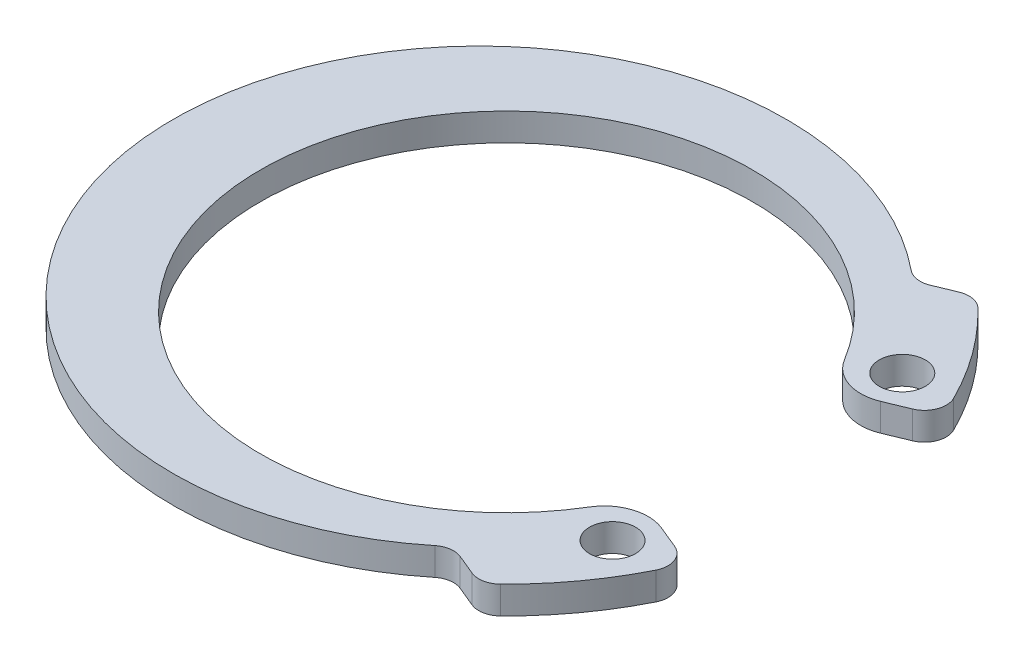
ISO-10303-21;
HEADER;
FILE_DESCRIPTION(('STEP AP214'),'2;1');
FILE_NAME('part.step','',(''),(''),'','','');
FILE_SCHEMA(('AUTOMOTIVE_DESIGN { 1 0 10303 214 1 1 1 1 }'));
ENDSEC;
DATA;
#1=APPLICATION_CONTEXT('core data for automotive mechanical design processes');
#2=APPLICATION_PROTOCOL_DEFINITION('international standard','automotive_design',2000,#1);
#3=PRODUCT_CONTEXT('',#1,'mechanical');
#4=PRODUCT('Part','Part','',(#3));
#5=PRODUCT_RELATED_PRODUCT_CATEGORY('part','',(#4));
#6=PRODUCT_DEFINITION_FORMATION('','',#4);
#7=PRODUCT_DEFINITION_CONTEXT('part definition',#1,'design');
#8=PRODUCT_DEFINITION('design','',#6,#7);
#9=PRODUCT_DEFINITION_SHAPE('','',#8);
#10=(LENGTH_UNIT() NAMED_UNIT(*) SI_UNIT(.MILLI.,.METRE.));
#11=(NAMED_UNIT(*) PLANE_ANGLE_UNIT() SI_UNIT($,.RADIAN.));
#12=(NAMED_UNIT(*) SI_UNIT($,.STERADIAN.) SOLID_ANGLE_UNIT());
#13=UNCERTAINTY_MEASURE_WITH_UNIT(LENGTH_MEASURE(1.E-05),#10,'distance_accuracy_value','');
#14=(GEOMETRIC_REPRESENTATION_CONTEXT(3) GLOBAL_UNCERTAINTY_ASSIGNED_CONTEXT((#13)) GLOBAL_UNIT_ASSIGNED_CONTEXT((#10,
#11,#12)) REPRESENTATION_CONTEXT('',''));
#15=CARTESIAN_POINT('',(0.,0.,0.));
#16=DIRECTION('',(0.,0.,1.));
#17=DIRECTION('',(1.,0.,0.));
#18=AXIS2_PLACEMENT_3D('',#15,#16,#17);
#19=CARTESIAN_POINT('',(4.7270544777057,0.3,4.85340921052434));
#20=DIRECTION('',(0.,1.,0.));
#21=DIRECTION('',(0.,0.,1.));
#22=AXIS2_PLACEMENT_3D('',#19,#20,#21);
#23=PLANE('',#22);
#24=CARTESIAN_POINT('',(5.45596004384196,0.3,3.15000000000001));
#25=DIRECTION('',(0.,1.,0.));
#26=DIRECTION('',(0.,0.,1.));
#27=AXIS2_PLACEMENT_3D('',#24,#25,#26);
#28=CIRCLE('',#27,0.5);
#29=CARTESIAN_POINT('',(5.45596004384196,0.3,3.65000000000001));
#30=VERTEX_POINT('',#29);
#31=EDGE_CURVE('E222',#30,#30,#28,.T.);
#32=ORIENTED_EDGE('',*,*,#31,.F.);
#33=EDGE_LOOP('',(#32));
#34=FACE_BOUND('',#33,.T.);
#35=CARTESIAN_POINT('',(4.7270544777057,0.3,4.85340921052434));
#36=DIRECTION('',(0.,1.,0.));
#37=DIRECTION('',(0.,0.,1.));
#38=AXIS2_PLACEMENT_3D('',#35,#36,#37);
#39=CIRCLE('',#38,0.475);
#40=CARTESIAN_POINT('',(4.54527984733229,0.3,5.2922519884672));
#41=VERTEX_POINT('',#40);
#42=CARTESIAN_POINT('',(5.05847158130869,0.3,5.19368513303342));
#43=VERTEX_POINT('',#42);
#44=EDGE_CURVE('E225',#41,#43,#39,.T.);
#45=ORIENTED_EDGE('',*,*,#44,.T.);
#46=CARTESIAN_POINT('',(0.,0.3,0.));
#47=DIRECTION('',(0.,1.,0.));
#48=DIRECTION('',(0.,0.,1.));
#49=AXIS2_PLACEMENT_3D('',#46,#47,#48);
#50=CIRCLE('',#49,7.25);
#51=CARTESIAN_POINT('',(6.48712499791998,0.3,3.23723790620364));
#52=VERTEX_POINT('',#51);
#53=EDGE_CURVE('E157',#43,#52,#50,.T.);
#54=ORIENTED_EDGE('',*,*,#53,.T.);
#55=CARTESIAN_POINT('',(6.0621064635735,0.3,3.02514300890064));
#56=DIRECTION('',(0.,1.,0.));
#57=DIRECTION('',(0.,0.,-1.));
#58=AXIS2_PLACEMENT_3D('',#55,#56,#57);
#59=CIRCLE('',#58,0.475);
#60=CARTESIAN_POINT('',(6.24388109394692,0.3,2.58630023095778));
#61=VERTEX_POINT('',#60);
#62=EDGE_CURVE('E228',#52,#61,#59,.T.);
#63=ORIENTED_EDGE('',*,*,#62,.T.);
#64=DIRECTION('',(-0.923879532511286,0.,-0.382683432365091));
#65=VECTOR('',#64,1.);
#66=CARTESIAN_POINT('',(5.75388582938839,0.3,2.38333754687904));
#67=LINE('',#66,#65);
#68=CARTESIAN_POINT('',(5.75388582938839,0.3,2.38333754687904));
#69=VERTEX_POINT('',#68);
#70=EDGE_CURVE('E230',#61,#69,#67,.T.);
#71=ORIENTED_EDGE('',*,*,#70,.T.);
#72=CARTESIAN_POINT('',(5.39033656864156,0.3,3.26102310276477));
#73=DIRECTION('',(0.,1.,0.));
#74=DIRECTION('',(0.,0.,1.));
#75=AXIS2_PLACEMENT_3D('',#72,#73,#74);
#76=CIRCLE('',#75,0.949999999999999);
#77=CARTESIAN_POINT('',(4.57750803844958,0.3,2.76928152377643));
#78=VERTEX_POINT('',#77);
#79=EDGE_CURVE('E232',#69,#78,#76,.T.);
#80=ORIENTED_EDGE('',*,*,#79,.T.);
#81=CARTESIAN_POINT('',(0.,0.3,0.));
#82=DIRECTION('',(0.,-1.,0.));
#83=DIRECTION('',(0.,0.,1.));
#84=AXIS2_PLACEMENT_3D('',#81,#82,#83);
#85=CIRCLE('',#84,5.35);
#86=CARTESIAN_POINT('',(4.57750803844958,0.3,-2.76928152377643));
#87=VERTEX_POINT('',#86);
#88=EDGE_CURVE('E234',#78,#87,#85,.T.);
#89=ORIENTED_EDGE('',*,*,#88,.T.);
#90=CARTESIAN_POINT('',(5.39033656864156,0.3,-3.26102310276477));
#91=DIRECTION('',(0.,1.,0.));
#92=DIRECTION('',(0.,0.,-1.));
#93=AXIS2_PLACEMENT_3D('',#90,#91,#92);
#94=CIRCLE('',#93,0.95);
#95=CARTESIAN_POINT('',(5.75388582938839,0.3,-2.38333754687904));
#96=VERTEX_POINT('',#95);
#97=EDGE_CURVE('E236',#87,#96,#94,.T.);
#98=ORIENTED_EDGE('',*,*,#97,.T.);
#99=DIRECTION('',(0.923879532511287,0.,-0.38268343236509));
#100=VECTOR('',#99,1.);
#101=CARTESIAN_POINT('',(5.75388582938839,0.3,-2.38333754687904));
#102=LINE('',#101,#100);
#103=CARTESIAN_POINT('',(6.24388109394692,0.3,-2.58630023095778));
#104=VERTEX_POINT('',#103);
#105=EDGE_CURVE('E238',#96,#104,#102,.T.);
#106=ORIENTED_EDGE('',*,*,#105,.T.);
#107=CARTESIAN_POINT('',(6.0621064635735,0.3,-3.02514300890064));
#108=DIRECTION('',(0.,1.,0.));
#109=DIRECTION('',(0.,0.,1.));
#110=AXIS2_PLACEMENT_3D('',#107,#108,#109);
#111=CIRCLE('',#110,0.475000000000001);
#112=CARTESIAN_POINT('',(6.48712499791998,0.3,-3.23723790620364));
#113=VERTEX_POINT('',#112);
#114=EDGE_CURVE('E240',#104,#113,#111,.T.);
#115=ORIENTED_EDGE('',*,*,#114,.T.);
#116=CARTESIAN_POINT('',(0.,0.3,0.));
#117=DIRECTION('',(0.,1.,0.));
#118=DIRECTION('',(0.,0.,-1.));
#119=AXIS2_PLACEMENT_3D('',#116,#117,#118);
#120=CIRCLE('',#119,7.25);
#121=CARTESIAN_POINT('',(5.05847158130868,0.3,-5.19368513303342));
#122=VERTEX_POINT('',#121);
#123=EDGE_CURVE('E242',#113,#122,#120,.T.);
#124=ORIENTED_EDGE('',*,*,#123,.T.);
#125=CARTESIAN_POINT('',(4.7270544777057,0.3,-4.85340921052434));
#126=DIRECTION('',(0.,1.,0.));
#127=DIRECTION('',(0.,0.,-1.));
#128=AXIS2_PLACEMENT_3D('',#125,#126,#127);
#129=CIRCLE('',#128,0.475000000000001);
#130=CARTESIAN_POINT('',(4.54527984733228,0.3,-5.2922519884672));
#131=VERTEX_POINT('',#130);
#132=EDGE_CURVE('E244',#122,#131,#129,.T.);
#133=ORIENTED_EDGE('',*,*,#132,.T.);
#134=DIRECTION('',(-0.923879532511286,0.,0.382683432365091));
#135=VECTOR('',#134,1.);
#136=CARTESIAN_POINT('',(4.10274092218613,0.3,-5.10894636379365));
#137=LINE('',#136,#135);
#138=CARTESIAN_POINT('',(4.10274092218613,0.3,-5.10894636379365));
#139=VERTEX_POINT('',#138);
#140=EDGE_CURVE('E246',#131,#139,#137,.T.);
#141=ORIENTED_EDGE('',*,*,#140,.T.);
#142=CARTESIAN_POINT('',(3.92096629181271,0.3,-5.54778914173651));
#143=DIRECTION('',(0.,-1.,0.));
#144=DIRECTION('',(0.,0.,1.));
#145=AXIS2_PLACEMENT_3D('',#142,#143,#144);
#146=CIRCLE('',#145,0.475);
#147=CARTESIAN_POINT('',(3.62167497495327,0.3,-5.1789399752029));
#148=VERTEX_POINT('',#147);
#149=EDGE_CURVE('E248',#139,#148,#146,.T.);
#150=ORIENTED_EDGE('',*,*,#149,.T.);
#151=CARTESIAN_POINT('',(-0.580616654661206,0.3,0.));
#152=DIRECTION('',(0.,1.,0.));
#153=DIRECTION('',(0.,0.,1.));
#154=AXIS2_PLACEMENT_3D('',#151,#152,#153);
#155=CIRCLE('',#154,6.66938334533879);
#156=CARTESIAN_POINT('',(3.62167497495327,0.3,5.1789399752029));
#157=VERTEX_POINT('',#156);
#158=EDGE_CURVE('E250',#148,#157,#155,.T.);
#159=ORIENTED_EDGE('',*,*,#158,.T.);
#160=CARTESIAN_POINT('',(3.92096629181271,0.3,5.54778914173651));
#161=DIRECTION('',(0.,-1.,0.));
#162=DIRECTION('',(0.,0.,-1.));
#163=AXIS2_PLACEMENT_3D('',#160,#161,#162);
#164=CIRCLE('',#163,0.474999999999999);
#165=CARTESIAN_POINT('',(4.10274092218613,0.3,5.10894636379365));
#166=VERTEX_POINT('',#165);
#167=EDGE_CURVE('E61',#157,#166,#164,.T.);
#168=ORIENTED_EDGE('',*,*,#167,.T.);
#169=DIRECTION('',(0.923879532511287,0.,0.382683432365089));
#170=VECTOR('',#169,1.);
#171=CARTESIAN_POINT('',(4.10274092218613,0.3,5.10894636379365));
#172=LINE('',#171,#170);
#173=EDGE_CURVE('E56',#166,#41,#172,.T.);
#174=ORIENTED_EDGE('',*,*,#173,.T.);
#175=EDGE_LOOP('',(#45,#54,#63,#71,#80,#89,#98,#106,#115,#124,#133,#141,#150,#159,#168,#174));
#176=FACE_BOUND('',#175,.T.);
#177=CARTESIAN_POINT('',(5.45596004384196,0.3,-3.15000000000001));
#178=DIRECTION('',(0.,1.,0.));
#179=DIRECTION('',(0.,0.,1.));
#180=AXIS2_PLACEMENT_3D('',#177,#178,#179);
#181=CIRCLE('',#180,0.5);
#182=CARTESIAN_POINT('',(5.45596004384196,0.3,-2.65000000000001));
#183=VERTEX_POINT('',#182);
#184=EDGE_CURVE('E219',#183,#183,#181,.T.);
#185=ORIENTED_EDGE('',*,*,#184,.F.);
#186=EDGE_LOOP('',(#185));
#187=FACE_BOUND('',#186,.T.);
#188=ADVANCED_FACE('F41',(#34,#176,#187),#23,.T.);
#189=CARTESIAN_POINT('',(4.7270544777057,0.3,4.85340921052434));
#190=DIRECTION('',(0.,-1.,0.));
#191=DIRECTION('',(0.,0.,-1.));
#192=AXIS2_PLACEMENT_3D('',#189,#190,#191);
#193=CYLINDRICAL_SURFACE('',#192,0.475);
#194=DIRECTION('',(0.,-1.,0.));
#195=VECTOR('',#194,1.);
#196=CARTESIAN_POINT('',(4.54527984733229,0.3,5.2922519884672));
#197=LINE('',#196,#195);
#198=CARTESIAN_POINT('',(4.54527984733229,-0.3,5.2922519884672));
#199=VERTEX_POINT('',#198);
#200=EDGE_CURVE('E172',#41,#199,#197,.T.);
#201=ORIENTED_EDGE('',*,*,#200,.T.);
#202=CARTESIAN_POINT('',(4.7270544777057,-0.3,4.85340921052434));
#203=DIRECTION('',(0.,1.,0.));
#204=DIRECTION('',(0.,0.,1.));
#205=AXIS2_PLACEMENT_3D('',#202,#203,#204);
#206=CIRCLE('',#205,0.475);
#207=CARTESIAN_POINT('',(5.05847158130869,-0.3,5.19368513303342));
#208=VERTEX_POINT('',#207);
#209=EDGE_CURVE('E166',#199,#208,#206,.T.);
#210=ORIENTED_EDGE('',*,*,#209,.T.);
#211=DIRECTION('',(0.,-1.,0.));
#212=VECTOR('',#211,1.);
#213=CARTESIAN_POINT('',(5.05847158130869,0.3,5.19368513303342));
#214=LINE('',#213,#212);
#215=EDGE_CURVE('E11',#43,#208,#214,.T.);
#216=ORIENTED_EDGE('',*,*,#215,.F.);
#217=ORIENTED_EDGE('',*,*,#44,.F.);
#218=EDGE_LOOP('',(#201,#210,#216,#217));
#219=FACE_BOUND('',#218,.T.);
#220=ADVANCED_FACE('F43',(#219),#193,.T.);
#221=CARTESIAN_POINT('',(0.,0.3,0.));
#222=DIRECTION('',(0.,-1.,0.));
#223=DIRECTION('',(0.,0.,-1.));
#224=AXIS2_PLACEMENT_3D('',#221,#222,#223);
#225=CYLINDRICAL_SURFACE('',#224,7.25);
#226=ORIENTED_EDGE('',*,*,#215,.T.);
#227=CARTESIAN_POINT('',(0.,-0.3,0.));
#228=DIRECTION('',(0.,1.,0.));
#229=DIRECTION('',(0.,0.,1.));
#230=AXIS2_PLACEMENT_3D('',#227,#228,#229);
#231=CIRCLE('',#230,7.25);
#232=CARTESIAN_POINT('',(6.48712499791998,-0.3,3.23723790620364));
#233=VERTEX_POINT('',#232);
#234=EDGE_CURVE('E156',#208,#233,#231,.T.);
#235=ORIENTED_EDGE('',*,*,#234,.T.);
#236=DIRECTION('',(0.,-1.,0.));
#237=VECTOR('',#236,1.);
#238=CARTESIAN_POINT('',(6.48712499791998,0.3,3.23723790620364));
#239=LINE('',#238,#237);
#240=EDGE_CURVE('E49',#52,#233,#239,.T.);
#241=ORIENTED_EDGE('',*,*,#240,.F.);
#242=ORIENTED_EDGE('',*,*,#53,.F.);
#243=EDGE_LOOP('',(#226,#235,#241,#242));
#244=FACE_BOUND('',#243,.T.);
#245=ADVANCED_FACE('F154',(#244),#225,.T.);
#246=CARTESIAN_POINT('',(6.0621064635735,0.3,3.02514300890064));
#247=DIRECTION('',(0.,-1.,0.));
#248=DIRECTION('',(0.,0.,-1.));
#249=AXIS2_PLACEMENT_3D('',#246,#247,#248);
#250=CYLINDRICAL_SURFACE('',#249,0.475);
#251=ORIENTED_EDGE('',*,*,#240,.T.);
#252=CARTESIAN_POINT('',(6.0621064635735,-0.3,3.02514300890064));
#253=DIRECTION('',(0.,1.,0.));
#254=DIRECTION('',(0.,0.,-1.));
#255=AXIS2_PLACEMENT_3D('',#252,#253,#254);
#256=CIRCLE('',#255,0.475);
#257=CARTESIAN_POINT('',(6.24388109394692,-0.3,2.58630023095778));
#258=VERTEX_POINT('',#257);
#259=EDGE_CURVE('E170',#233,#258,#256,.T.);
#260=ORIENTED_EDGE('',*,*,#259,.T.);
#261=DIRECTION('',(0.,-1.,0.));
#262=VECTOR('',#261,1.);
#263=CARTESIAN_POINT('',(6.24388109394692,0.3,2.58630023095778));
#264=LINE('',#263,#262);
#265=EDGE_CURVE('E279',#61,#258,#264,.T.);
#266=ORIENTED_EDGE('',*,*,#265,.F.);
#267=ORIENTED_EDGE('',*,*,#62,.F.);
#268=EDGE_LOOP('',(#251,#260,#266,#267));
#269=FACE_BOUND('',#268,.T.);
#270=ADVANCED_FACE('F282',(#269),#250,.T.);
#271=CARTESIAN_POINT('',(5.75388582938839,0.3,2.38333754687904));
#272=DIRECTION('',(-0.382683432365091,0.,0.923879532511286));
#273=DIRECTION('',(0.923879532511286,0.,0.382683432365091));
#274=AXIS2_PLACEMENT_3D('',#271,#272,#273);
#275=PLANE('',#274);
#276=ORIENTED_EDGE('',*,*,#265,.T.);
#277=DIRECTION('',(-0.923879532511286,0.,-0.382683432365091));
#278=VECTOR('',#277,1.);
#279=CARTESIAN_POINT('',(5.75388582938839,-0.3,2.38333754687904));
#280=LINE('',#279,#278);
#281=CARTESIAN_POINT('',(5.75388582938839,-0.3,2.38333754687904));
#282=VERTEX_POINT('',#281);
#283=EDGE_CURVE('E181',#258,#282,#280,.T.);
#284=ORIENTED_EDGE('',*,*,#283,.T.);
#285=DIRECTION('',(0.,-1.,0.));
#286=VECTOR('',#285,1.);
#287=CARTESIAN_POINT('',(5.75388582938839,0.3,2.38333754687904));
#288=LINE('',#287,#286);
#289=EDGE_CURVE('E277',#69,#282,#288,.T.);
#290=ORIENTED_EDGE('',*,*,#289,.F.);
#291=ORIENTED_EDGE('',*,*,#70,.F.);
#292=EDGE_LOOP('',(#276,#284,#290,#291));
#293=FACE_BOUND('',#292,.T.);
#294=ADVANCED_FACE('F290',(#293),#275,.F.);
#295=CARTESIAN_POINT('',(5.39033656864156,0.3,3.26102310276477));
#296=DIRECTION('',(0.,-1.,0.));
#297=DIRECTION('',(0.,0.,-1.));
#298=AXIS2_PLACEMENT_3D('',#295,#296,#297);
#299=CYLINDRICAL_SURFACE('',#298,0.949999999999999);
#300=ORIENTED_EDGE('',*,*,#289,.T.);
#301=CARTESIAN_POINT('',(5.39033656864156,-0.3,3.26102310276477));
#302=DIRECTION('',(0.,1.,0.));
#303=DIRECTION('',(0.,0.,1.));
#304=AXIS2_PLACEMENT_3D('',#301,#302,#303);
#305=CIRCLE('',#304,0.949999999999999);
#306=CARTESIAN_POINT('',(4.57750803844958,-0.3,2.76928152377643));
#307=VERTEX_POINT('',#306);
#308=EDGE_CURVE('E184',#282,#307,#305,.T.);
#309=ORIENTED_EDGE('',*,*,#308,.T.);
#310=DIRECTION('',(0.,-1.,0.));
#311=VECTOR('',#310,1.);
#312=CARTESIAN_POINT('',(4.57750803844958,0.3,2.76928152377643));
#313=LINE('',#312,#311);
#314=EDGE_CURVE('E275',#78,#307,#313,.T.);
#315=ORIENTED_EDGE('',*,*,#314,.F.);
#316=ORIENTED_EDGE('',*,*,#79,.F.);
#317=EDGE_LOOP('',(#300,#309,#315,#316));
#318=FACE_BOUND('',#317,.T.);
#319=ADVANCED_FACE('F293',(#318),#299,.T.);
#320=CARTESIAN_POINT('',(0.,0.3,0.));
#321=DIRECTION('',(0.,-1.,0.));
#322=DIRECTION('',(0.,0.,-1.));
#323=AXIS2_PLACEMENT_3D('',#320,#321,#322);
#324=CYLINDRICAL_SURFACE('',#323,5.35);
#325=ORIENTED_EDGE('',*,*,#314,.T.);
#326=CARTESIAN_POINT('',(0.,-0.3,0.));
#327=DIRECTION('',(0.,-1.,0.));
#328=DIRECTION('',(0.,0.,1.));
#329=AXIS2_PLACEMENT_3D('',#326,#327,#328);
#330=CIRCLE('',#329,5.35);
#331=CARTESIAN_POINT('',(4.57750803844958,-0.3,-2.76928152377643));
#332=VERTEX_POINT('',#331);
#333=EDGE_CURVE('E187',#307,#332,#330,.T.);
#334=ORIENTED_EDGE('',*,*,#333,.T.);
#335=DIRECTION('',(0.,-1.,0.));
#336=VECTOR('',#335,1.);
#337=CARTESIAN_POINT('',(4.57750803844958,0.3,-2.76928152377643));
#338=LINE('',#337,#336);
#339=EDGE_CURVE('E273',#87,#332,#338,.T.);
#340=ORIENTED_EDGE('',*,*,#339,.F.);
#341=ORIENTED_EDGE('',*,*,#88,.F.);
#342=EDGE_LOOP('',(#325,#334,#340,#341));
#343=FACE_BOUND('',#342,.T.);
#344=ADVANCED_FACE('F298',(#343),#324,.F.);
#345=CARTESIAN_POINT('',(5.39033656864156,0.3,-3.26102310276477));
#346=DIRECTION('',(0.,-1.,0.));
#347=DIRECTION('',(0.,0.,-1.));
#348=AXIS2_PLACEMENT_3D('',#345,#346,#347);
#349=CYLINDRICAL_SURFACE('',#348,0.95);
#350=ORIENTED_EDGE('',*,*,#339,.T.);
#351=CARTESIAN_POINT('',(5.39033656864156,-0.3,-3.26102310276477));
#352=DIRECTION('',(0.,1.,0.));
#353=DIRECTION('',(0.,0.,-1.));
#354=AXIS2_PLACEMENT_3D('',#351,#352,#353);
#355=CIRCLE('',#354,0.95);
#356=CARTESIAN_POINT('',(5.75388582938839,-0.3,-2.38333754687904));
#357=VERTEX_POINT('',#356);
#358=EDGE_CURVE('E190',#332,#357,#355,.T.);
#359=ORIENTED_EDGE('',*,*,#358,.T.);
#360=DIRECTION('',(0.,-1.,0.));
#361=VECTOR('',#360,1.);
#362=CARTESIAN_POINT('',(5.75388582938839,0.3,-2.38333754687904));
#363=LINE('',#362,#361);
#364=EDGE_CURVE('E271',#96,#357,#363,.T.);
#365=ORIENTED_EDGE('',*,*,#364,.F.);
#366=ORIENTED_EDGE('',*,*,#97,.F.);
#367=EDGE_LOOP('',(#350,#359,#365,#366));
#368=FACE_BOUND('',#367,.T.);
#369=ADVANCED_FACE('F304',(#368),#349,.T.);
#370=CARTESIAN_POINT('',(5.75388582938839,0.3,-2.38333754687904));
#371=DIRECTION('',(-0.38268343236509,0.,-0.923879532511287));
#372=DIRECTION('',(-0.923879532511287,0.,0.38268343236509));
#373=AXIS2_PLACEMENT_3D('',#370,#371,#372);
#374=PLANE('',#373);
#375=ORIENTED_EDGE('',*,*,#364,.T.);
#376=DIRECTION('',(0.923879532511287,0.,-0.38268343236509));
#377=VECTOR('',#376,1.);
#378=CARTESIAN_POINT('',(5.75388582938839,-0.3,-2.38333754687904));
#379=LINE('',#378,#377);
#380=CARTESIAN_POINT('',(6.24388109394692,-0.3,-2.58630023095778));
#381=VERTEX_POINT('',#380);
#382=EDGE_CURVE('E193',#357,#381,#379,.T.);
#383=ORIENTED_EDGE('',*,*,#382,.T.);
#384=DIRECTION('',(0.,-1.,0.));
#385=VECTOR('',#384,1.);
#386=CARTESIAN_POINT('',(6.24388109394692,0.3,-2.58630023095778));
#387=LINE('',#386,#385);
#388=EDGE_CURVE('E269',#104,#381,#387,.T.);
#389=ORIENTED_EDGE('',*,*,#388,.F.);
#390=ORIENTED_EDGE('',*,*,#105,.F.);
#391=EDGE_LOOP('',(#375,#383,#389,#390));
#392=FACE_BOUND('',#391,.T.);
#393=ADVANCED_FACE('F308',(#392),#374,.F.);
#394=CARTESIAN_POINT('',(6.0621064635735,0.3,-3.02514300890064));
#395=DIRECTION('',(0.,-1.,0.));
#396=DIRECTION('',(0.,0.,-1.));
#397=AXIS2_PLACEMENT_3D('',#394,#395,#396);
#398=CYLINDRICAL_SURFACE('',#397,0.475000000000001);
#399=ORIENTED_EDGE('',*,*,#388,.T.);
#400=CARTESIAN_POINT('',(6.0621064635735,-0.3,-3.02514300890064));
#401=DIRECTION('',(0.,1.,0.));
#402=DIRECTION('',(0.,0.,1.));
#403=AXIS2_PLACEMENT_3D('',#400,#401,#402);
#404=CIRCLE('',#403,0.475000000000001);
#405=CARTESIAN_POINT('',(6.48712499791998,-0.3,-3.23723790620364));
#406=VERTEX_POINT('',#405);
#407=EDGE_CURVE('E196',#381,#406,#404,.T.);
#408=ORIENTED_EDGE('',*,*,#407,.T.);
#409=DIRECTION('',(0.,-1.,0.));
#410=VECTOR('',#409,1.);
#411=CARTESIAN_POINT('',(6.48712499791998,0.3,-3.23723790620364));
#412=LINE('',#411,#410);
#413=EDGE_CURVE('E267',#113,#406,#412,.T.);
#414=ORIENTED_EDGE('',*,*,#413,.F.);
#415=ORIENTED_EDGE('',*,*,#114,.F.);
#416=EDGE_LOOP('',(#399,#408,#414,#415));
#417=FACE_BOUND('',#416,.T.);
#418=ADVANCED_FACE('F313',(#417),#398,.T.);
#419=CARTESIAN_POINT('',(0.,0.3,0.));
#420=DIRECTION('',(0.,-1.,0.));
#421=DIRECTION('',(0.,0.,-1.));
#422=AXIS2_PLACEMENT_3D('',#419,#420,#421);
#423=CYLINDRICAL_SURFACE('',#422,7.25);
#424=ORIENTED_EDGE('',*,*,#413,.T.);
#425=CARTESIAN_POINT('',(0.,-0.3,0.));
#426=DIRECTION('',(0.,1.,0.));
#427=DIRECTION('',(0.,0.,-1.));
#428=AXIS2_PLACEMENT_3D('',#425,#426,#427);
#429=CIRCLE('',#428,7.25);
#430=CARTESIAN_POINT('',(5.05847158130868,-0.3,-5.19368513303342));
#431=VERTEX_POINT('',#430);
#432=EDGE_CURVE('E199',#406,#431,#429,.T.);
#433=ORIENTED_EDGE('',*,*,#432,.T.);
#434=DIRECTION('',(0.,-1.,0.));
#435=VECTOR('',#434,1.);
#436=CARTESIAN_POINT('',(5.05847158130868,0.3,-5.19368513303342));
#437=LINE('',#436,#435);
#438=EDGE_CURVE('E265',#122,#431,#437,.T.);
#439=ORIENTED_EDGE('',*,*,#438,.F.);
#440=ORIENTED_EDGE('',*,*,#123,.F.);
#441=EDGE_LOOP('',(#424,#433,#439,#440));
#442=FACE_BOUND('',#441,.T.);
#443=ADVANCED_FACE('F319',(#442),#423,.T.);
#444=CARTESIAN_POINT('',(4.7270544777057,0.3,-4.85340921052434));
#445=DIRECTION('',(0.,-1.,0.));
#446=DIRECTION('',(0.,0.,-1.));
#447=AXIS2_PLACEMENT_3D('',#444,#445,#446);
#448=CYLINDRICAL_SURFACE('',#447,0.475000000000001);
#449=ORIENTED_EDGE('',*,*,#438,.T.);
#450=CARTESIAN_POINT('',(4.7270544777057,-0.3,-4.85340921052434));
#451=DIRECTION('',(0.,1.,0.));
#452=DIRECTION('',(0.,0.,-1.));
#453=AXIS2_PLACEMENT_3D('',#450,#451,#452);
#454=CIRCLE('',#453,0.475000000000001);
#455=CARTESIAN_POINT('',(4.54527984733228,-0.3,-5.2922519884672));
#456=VERTEX_POINT('',#455);
#457=EDGE_CURVE('E202',#431,#456,#454,.T.);
#458=ORIENTED_EDGE('',*,*,#457,.T.);
#459=DIRECTION('',(0.,-1.,0.));
#460=VECTOR('',#459,1.);
#461=CARTESIAN_POINT('',(4.54527984733228,0.3,-5.2922519884672));
#462=LINE('',#461,#460);
#463=EDGE_CURVE('E263',#131,#456,#462,.T.);
#464=ORIENTED_EDGE('',*,*,#463,.F.);
#465=ORIENTED_EDGE('',*,*,#132,.F.);
#466=EDGE_LOOP('',(#449,#458,#464,#465));
#467=FACE_BOUND('',#466,.T.);
#468=ADVANCED_FACE('F323',(#467),#448,.T.);
#469=CARTESIAN_POINT('',(4.10274092218613,0.3,-5.10894636379365));
#470=DIRECTION('',(0.382683432365091,0.,0.923879532511286));
#471=DIRECTION('',(0.923879532511286,0.,-0.382683432365091));
#472=AXIS2_PLACEMENT_3D('',#469,#470,#471);
#473=PLANE('',#472);
#474=ORIENTED_EDGE('',*,*,#463,.T.);
#475=DIRECTION('',(-0.923879532511286,0.,0.382683432365091));
#476=VECTOR('',#475,1.);
#477=CARTESIAN_POINT('',(4.10274092218613,-0.3,-5.10894636379365));
#478=LINE('',#477,#476);
#479=CARTESIAN_POINT('',(4.10274092218613,-0.3,-5.10894636379365));
#480=VERTEX_POINT('',#479);
#481=EDGE_CURVE('E205',#456,#480,#478,.T.);
#482=ORIENTED_EDGE('',*,*,#481,.T.);
#483=DIRECTION('',(0.,-1.,0.));
#484=VECTOR('',#483,1.);
#485=CARTESIAN_POINT('',(4.10274092218613,0.3,-5.10894636379365));
#486=LINE('',#485,#484);
#487=EDGE_CURVE('E261',#139,#480,#486,.T.);
#488=ORIENTED_EDGE('',*,*,#487,.F.);
#489=ORIENTED_EDGE('',*,*,#140,.F.);
#490=EDGE_LOOP('',(#474,#482,#488,#489));
#491=FACE_BOUND('',#490,.T.);
#492=ADVANCED_FACE('F328',(#491),#473,.F.);
#493=CARTESIAN_POINT('',(3.92096629181271,0.3,-5.54778914173651));
#494=DIRECTION('',(0.,-1.,0.));
#495=DIRECTION('',(0.,0.,-1.));
#496=AXIS2_PLACEMENT_3D('',#493,#494,#495);
#497=CYLINDRICAL_SURFACE('',#496,0.475);
#498=ORIENTED_EDGE('',*,*,#487,.T.);
#499=CARTESIAN_POINT('',(3.92096629181271,-0.3,-5.54778914173651));
#500=DIRECTION('',(0.,-1.,0.));
#501=DIRECTION('',(0.,0.,1.));
#502=AXIS2_PLACEMENT_3D('',#499,#500,#501);
#503=CIRCLE('',#502,0.475);
#504=CARTESIAN_POINT('',(3.62167497495327,-0.3,-5.1789399752029));
#505=VERTEX_POINT('',#504);
#506=EDGE_CURVE('E208',#480,#505,#503,.T.);
#507=ORIENTED_EDGE('',*,*,#506,.T.);
#508=DIRECTION('',(0.,-1.,0.));
#509=VECTOR('',#508,1.);
#510=CARTESIAN_POINT('',(3.62167497495327,0.3,-5.1789399752029));
#511=LINE('',#510,#509);
#512=EDGE_CURVE('E259',#148,#505,#511,.T.);
#513=ORIENTED_EDGE('',*,*,#512,.F.);
#514=ORIENTED_EDGE('',*,*,#149,.F.);
#515=EDGE_LOOP('',(#498,#507,#513,#514));
#516=FACE_BOUND('',#515,.T.);
#517=ADVANCED_FACE('F334',(#516),#497,.F.);
#518=CARTESIAN_POINT('',(-0.580616654661206,0.3,0.));
#519=DIRECTION('',(0.,-1.,0.));
#520=DIRECTION('',(0.,0.,-1.));
#521=AXIS2_PLACEMENT_3D('',#518,#519,#520);
#522=CYLINDRICAL_SURFACE('',#521,6.66938334533879);
#523=ORIENTED_EDGE('',*,*,#512,.T.);
#524=CARTESIAN_POINT('',(-0.580616654661206,-0.3,0.));
#525=DIRECTION('',(0.,1.,0.));
#526=DIRECTION('',(0.,0.,1.));
#527=AXIS2_PLACEMENT_3D('',#524,#525,#526);
#528=CIRCLE('',#527,6.66938334533879);
#529=CARTESIAN_POINT('',(3.62167497495327,-0.3,5.1789399752029));
#530=VERTEX_POINT('',#529);
#531=EDGE_CURVE('E211',#505,#530,#528,.T.);
#532=ORIENTED_EDGE('',*,*,#531,.T.);
#533=DIRECTION('',(0.,-1.,0.));
#534=VECTOR('',#533,1.);
#535=CARTESIAN_POINT('',(3.62167497495327,0.3,5.1789399752029));
#536=LINE('',#535,#534);
#537=EDGE_CURVE('E257',#157,#530,#536,.T.);
#538=ORIENTED_EDGE('',*,*,#537,.F.);
#539=ORIENTED_EDGE('',*,*,#158,.F.);
#540=EDGE_LOOP('',(#523,#532,#538,#539));
#541=FACE_BOUND('',#540,.T.);
#542=ADVANCED_FACE('F338',(#541),#522,.T.);
#543=CARTESIAN_POINT('',(3.92096629181271,0.3,5.54778914173651));
#544=DIRECTION('',(0.,-1.,0.));
#545=DIRECTION('',(0.,0.,-1.));
#546=AXIS2_PLACEMENT_3D('',#543,#544,#545);
#547=CYLINDRICAL_SURFACE('',#546,0.474999999999999);
#548=ORIENTED_EDGE('',*,*,#537,.T.);
#549=CARTESIAN_POINT('',(3.92096629181271,-0.3,5.54778914173651));
#550=DIRECTION('',(0.,-1.,0.));
#551=DIRECTION('',(0.,0.,-1.));
#552=AXIS2_PLACEMENT_3D('',#549,#550,#551);
#553=CIRCLE('',#552,0.474999999999999);
#554=CARTESIAN_POINT('',(4.10274092218613,-0.3,5.10894636379365));
#555=VERTEX_POINT('',#554);
#556=EDGE_CURVE('E214',#530,#555,#553,.T.);
#557=ORIENTED_EDGE('',*,*,#556,.T.);
#558=DIRECTION('',(0.,-1.,0.));
#559=VECTOR('',#558,1.);
#560=CARTESIAN_POINT('',(4.10274092218613,0.3,5.10894636379365));
#561=LINE('',#560,#559);
#562=EDGE_CURVE('E255',#166,#555,#561,.T.);
#563=ORIENTED_EDGE('',*,*,#562,.F.);
#564=ORIENTED_EDGE('',*,*,#167,.F.);
#565=EDGE_LOOP('',(#548,#557,#563,#564));
#566=FACE_BOUND('',#565,.T.);
#567=ADVANCED_FACE('F341',(#566),#547,.F.);
#568=CARTESIAN_POINT('',(4.10274092218613,0.3,5.10894636379365));
#569=DIRECTION('',(0.382683432365089,0.,-0.923879532511287));
#570=DIRECTION('',(-0.923879532511287,0.,-0.382683432365089));
#571=AXIS2_PLACEMENT_3D('',#568,#569,#570);
#572=PLANE('',#571);
#573=ORIENTED_EDGE('',*,*,#562,.T.);
#574=DIRECTION('',(0.923879532511287,0.,0.382683432365089));
#575=VECTOR('',#574,1.);
#576=CARTESIAN_POINT('',(4.10274092218613,-0.3,5.10894636379365));
#577=LINE('',#576,#575);
#578=EDGE_CURVE('E217',#555,#199,#577,.T.);
#579=ORIENTED_EDGE('',*,*,#578,.T.);
#580=ORIENTED_EDGE('',*,*,#200,.F.);
#581=ORIENTED_EDGE('',*,*,#173,.F.);
#582=EDGE_LOOP('',(#573,#579,#580,#581));
#583=FACE_BOUND('',#582,.T.);
#584=ADVANCED_FACE('F343',(#583),#572,.F.);
#585=CARTESIAN_POINT('',(5.45596004384196,0.3,3.15000000000001));
#586=DIRECTION('',(0.,-1.,0.));
#587=DIRECTION('',(0.,0.,-1.));
#588=AXIS2_PLACEMENT_3D('',#585,#586,#587);
#589=CYLINDRICAL_SURFACE('',#588,0.5);
#590=ORIENTED_EDGE('',*,*,#31,.T.);
#591=EDGE_LOOP('',(#590));
#592=FACE_BOUND('',#591,.T.);
#593=CARTESIAN_POINT('',(5.45596004384196,-0.3,3.15000000000001));
#594=DIRECTION('',(0.,1.,0.));
#595=DIRECTION('',(0.,0.,1.));
#596=AXIS2_PLACEMENT_3D('',#593,#594,#595);
#597=CIRCLE('',#596,0.5);
#598=CARTESIAN_POINT('',(5.45596004384196,-0.3,3.65000000000001));
#599=VERTEX_POINT('',#598);
#600=EDGE_CURVE('E173',#599,#599,#597,.T.);
#601=ORIENTED_EDGE('',*,*,#600,.F.);
#602=EDGE_LOOP('',(#601));
#603=FACE_BOUND('',#602,.T.);
#604=ADVANCED_FACE('F345',(#592,#603),#589,.F.);
#605=CARTESIAN_POINT('',(5.45596004384196,0.3,-3.15000000000001));
#606=DIRECTION('',(0.,-1.,0.));
#607=DIRECTION('',(0.,0.,-1.));
#608=AXIS2_PLACEMENT_3D('',#605,#606,#607);
#609=CYLINDRICAL_SURFACE('',#608,0.5);
#610=ORIENTED_EDGE('',*,*,#184,.T.);
#611=EDGE_LOOP('',(#610));
#612=FACE_BOUND('',#611,.T.);
#613=CARTESIAN_POINT('',(5.45596004384196,-0.3,-3.15000000000001));
#614=DIRECTION('',(0.,1.,0.));
#615=DIRECTION('',(0.,0.,1.));
#616=AXIS2_PLACEMENT_3D('',#613,#614,#615);
#617=CIRCLE('',#616,0.5);
#618=CARTESIAN_POINT('',(5.45596004384196,-0.3,-2.65000000000001));
#619=VERTEX_POINT('',#618);
#620=EDGE_CURVE('E176',#619,#619,#617,.T.);
#621=ORIENTED_EDGE('',*,*,#620,.F.);
#622=EDGE_LOOP('',(#621));
#623=FACE_BOUND('',#622,.T.);
#624=ADVANCED_FACE('F351',(#612,#623),#609,.F.);
#625=CARTESIAN_POINT('',(4.7270544777057,-0.3,4.85340921052434));
#626=DIRECTION('',(0.,1.,0.));
#627=DIRECTION('',(0.,0.,1.));
#628=AXIS2_PLACEMENT_3D('',#625,#626,#627);
#629=PLANE('',#628);
#630=ORIENTED_EDGE('',*,*,#620,.T.);
#631=EDGE_LOOP('',(#630));
#632=FACE_BOUND('',#631,.T.);
#633=ORIENTED_EDGE('',*,*,#600,.T.);
#634=EDGE_LOOP('',(#633));
#635=FACE_BOUND('',#634,.T.);
#636=ORIENTED_EDGE('',*,*,#209,.F.);
#637=ORIENTED_EDGE('',*,*,#578,.F.);
#638=ORIENTED_EDGE('',*,*,#556,.F.);
#639=ORIENTED_EDGE('',*,*,#531,.F.);
#640=ORIENTED_EDGE('',*,*,#506,.F.);
#641=ORIENTED_EDGE('',*,*,#481,.F.);
#642=ORIENTED_EDGE('',*,*,#457,.F.);
#643=ORIENTED_EDGE('',*,*,#432,.F.);
#644=ORIENTED_EDGE('',*,*,#407,.F.);
#645=ORIENTED_EDGE('',*,*,#382,.F.);
#646=ORIENTED_EDGE('',*,*,#358,.F.);
#647=ORIENTED_EDGE('',*,*,#333,.F.);
#648=ORIENTED_EDGE('',*,*,#308,.F.);
#649=ORIENTED_EDGE('',*,*,#283,.F.);
#650=ORIENTED_EDGE('',*,*,#259,.F.);
#651=ORIENTED_EDGE('',*,*,#234,.F.);
#652=EDGE_LOOP('',(#636,#637,#638,#639,#640,#641,#642,#643,#644,#645,#646,#647,#648,#649,#650,#651));
#653=FACE_BOUND('',#652,.T.);
#654=ADVANCED_FACE('F164',(#632,#635,#653),#629,.F.);
#655=CLOSED_SHELL('',(#188,#220,#245,#270,#294,#319,#344,#369,#393,#418,#443,#468,#492,#517,
#542,#567,#584,#604,#624,#654));
#656=MANIFOLD_SOLID_BREP('B2',#655);
#657=ADVANCED_BREP_SHAPE_REPRESENTATION('',(#18,#656),#14);
#658=SHAPE_DEFINITION_REPRESENTATION(#9,#657);
ENDSEC;
END-ISO-10303-21;
